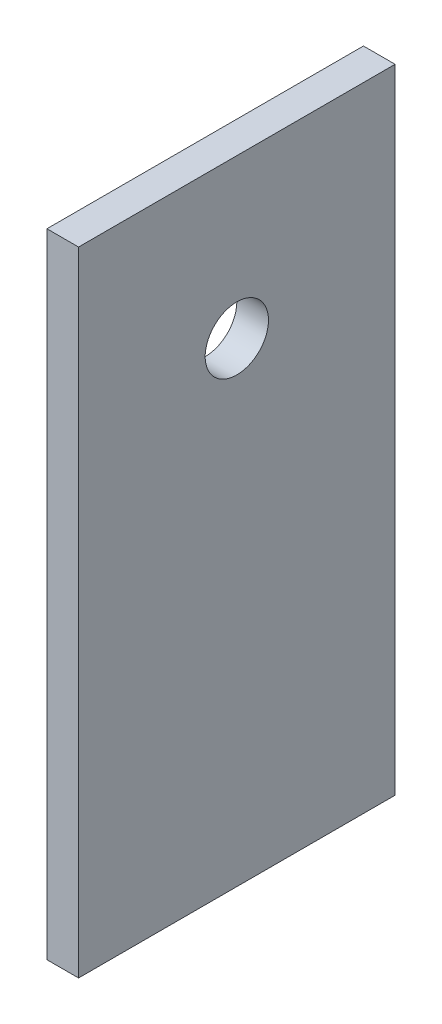
ISO-10303-21;
HEADER;
FILE_DESCRIPTION(('STEP AP214'),'2;1');
FILE_NAME('part.step','',(''),(''),'','','');
FILE_SCHEMA(('AUTOMOTIVE_DESIGN { 1 0 10303 214 1 1 1 1 }'));
ENDSEC;
DATA;
#1=APPLICATION_CONTEXT('core data for automotive mechanical design processes');
#2=APPLICATION_PROTOCOL_DEFINITION('international standard','automotive_design',2000,#1);
#3=PRODUCT_CONTEXT('',#1,'mechanical');
#4=PRODUCT('Part','Part','',(#3));
#5=PRODUCT_RELATED_PRODUCT_CATEGORY('part','',(#4));
#6=PRODUCT_DEFINITION_FORMATION('','',#4);
#7=PRODUCT_DEFINITION_CONTEXT('part definition',#1,'design');
#8=PRODUCT_DEFINITION('design','',#6,#7);
#9=PRODUCT_DEFINITION_SHAPE('','',#8);
#10=(LENGTH_UNIT() NAMED_UNIT(*) SI_UNIT(.MILLI.,.METRE.));
#11=(NAMED_UNIT(*) PLANE_ANGLE_UNIT() SI_UNIT($,.RADIAN.));
#12=(NAMED_UNIT(*) SI_UNIT($,.STERADIAN.) SOLID_ANGLE_UNIT());
#13=UNCERTAINTY_MEASURE_WITH_UNIT(LENGTH_MEASURE(1.E-05),#10,'distance_accuracy_value','');
#14=(GEOMETRIC_REPRESENTATION_CONTEXT(3) GLOBAL_UNCERTAINTY_ASSIGNED_CONTEXT((#13)) GLOBAL_UNIT_ASSIGNED_CONTEXT((#10,
#11,#12)) REPRESENTATION_CONTEXT('',''));
#15=CARTESIAN_POINT('',(0.,0.,0.));
#16=DIRECTION('',(0.,0.,1.));
#17=DIRECTION('',(1.,0.,0.));
#18=AXIS2_PLACEMENT_3D('',#15,#16,#17);
#19=CARTESIAN_POINT('',(4.,0.,0.));
#20=DIRECTION('',(1.,0.,0.));
#21=DIRECTION('',(0.,0.,-1.));
#22=AXIS2_PLACEMENT_3D('',#19,#20,#21);
#23=PLANE('',#22);
#24=DIRECTION('',(0.,1.,0.));
#25=VECTOR('',#24,1.);
#26=CARTESIAN_POINT('',(4.,-42.4999999999999,-20.));
#27=LINE('',#26,#25);
#28=CARTESIAN_POINT('',(4.,-122.5,-20.));
#29=VERTEX_POINT('',#28);
#30=CARTESIAN_POINT('',(4.,-42.4999999999999,-20.));
#31=VERTEX_POINT('',#30);
#32=EDGE_CURVE('E92',#29,#31,#27,.T.);
#33=ORIENTED_EDGE('',*,*,#32,.T.);
#34=DIRECTION('',(0.,0.,1.));
#35=VECTOR('',#34,1.);
#36=CARTESIAN_POINT('',(4.,-42.4999999999999,20.));
#37=LINE('',#36,#35);
#38=CARTESIAN_POINT('',(4.,-42.4999999999999,20.));
#39=VERTEX_POINT('',#38);
#40=EDGE_CURVE('E87',#31,#39,#37,.T.);
#41=ORIENTED_EDGE('',*,*,#40,.T.);
#42=DIRECTION('',(0.,-1.,0.));
#43=VECTOR('',#42,1.);
#44=CARTESIAN_POINT('',(4.,-42.4999999999999,20.));
#45=LINE('',#44,#43);
#46=CARTESIAN_POINT('',(4.,-122.5,20.));
#47=VERTEX_POINT('',#46);
#48=EDGE_CURVE('E90',#39,#47,#45,.T.);
#49=ORIENTED_EDGE('',*,*,#48,.T.);
#50=DIRECTION('',(0.,0.,-1.));
#51=VECTOR('',#50,1.);
#52=CARTESIAN_POINT('',(4.,-122.5,20.));
#53=LINE('',#52,#51);
#54=EDGE_CURVE('E57',#47,#29,#53,.T.);
#55=ORIENTED_EDGE('',*,*,#54,.T.);
#56=EDGE_LOOP('',(#33,#41,#49,#55));
#57=FACE_BOUND('',#56,.T.);
#58=CARTESIAN_POINT('',(4.,-62.4999999999999,0.));
#59=DIRECTION('',(1.,0.,0.));
#60=DIRECTION('',(0.,0.,-1.));
#61=AXIS2_PLACEMENT_3D('',#58,#59,#60);
#62=CIRCLE('',#61,4.);
#63=CARTESIAN_POINT('',(4.,-62.4999999999999,-4.));
#64=VERTEX_POINT('',#63);
#65=EDGE_CURVE('E112',#64,#64,#62,.T.);
#66=ORIENTED_EDGE('',*,*,#65,.F.);
#67=EDGE_LOOP('',(#66));
#68=FACE_BOUND('',#67,.T.);
#69=ADVANCED_FACE('F39',(#57,#68),#23,.T.);
#70=CARTESIAN_POINT('',(0.,0.,0.));
#71=DIRECTION('',(1.,0.,0.));
#72=DIRECTION('',(0.,0.,-1.));
#73=AXIS2_PLACEMENT_3D('',#70,#71,#72);
#74=PLANE('',#73);
#75=DIRECTION('',(0.,1.,0.));
#76=VECTOR('',#75,1.);
#77=CARTESIAN_POINT('',(0.,-42.4999999999999,-20.));
#78=LINE('',#77,#76);
#79=CARTESIAN_POINT('',(0.,-122.5,-20.));
#80=VERTEX_POINT('',#79);
#81=CARTESIAN_POINT('',(0.,-42.4999999999999,-20.));
#82=VERTEX_POINT('',#81);
#83=EDGE_CURVE('E108',#80,#82,#78,.T.);
#84=ORIENTED_EDGE('',*,*,#83,.F.);
#85=DIRECTION('',(0.,0.,-1.));
#86=VECTOR('',#85,1.);
#87=CARTESIAN_POINT('',(0.,-122.5,20.));
#88=LINE('',#87,#86);
#89=CARTESIAN_POINT('',(0.,-122.5,20.));
#90=VERTEX_POINT('',#89);
#91=EDGE_CURVE('E80',#90,#80,#88,.T.);
#92=ORIENTED_EDGE('',*,*,#91,.F.);
#93=DIRECTION('',(0.,-1.,0.));
#94=VECTOR('',#93,1.);
#95=CARTESIAN_POINT('',(0.,-42.4999999999999,20.));
#96=LINE('',#95,#94);
#97=CARTESIAN_POINT('',(0.,-42.4999999999999,20.));
#98=VERTEX_POINT('',#97);
#99=EDGE_CURVE('E74',#98,#90,#96,.T.);
#100=ORIENTED_EDGE('',*,*,#99,.F.);
#101=DIRECTION('',(0.,0.,1.));
#102=VECTOR('',#101,1.);
#103=CARTESIAN_POINT('',(0.,-42.4999999999999,20.));
#104=LINE('',#103,#102);
#105=EDGE_CURVE('E97',#82,#98,#104,.T.);
#106=ORIENTED_EDGE('',*,*,#105,.F.);
#107=EDGE_LOOP('',(#84,#92,#100,#106));
#108=FACE_BOUND('',#107,.T.);
#109=CARTESIAN_POINT('',(0.,-62.4999999999999,0.));
#110=DIRECTION('',(1.,0.,0.));
#111=DIRECTION('',(0.,0.,-1.));
#112=AXIS2_PLACEMENT_3D('',#109,#110,#111);
#113=CIRCLE('',#112,4.);
#114=CARTESIAN_POINT('',(0.,-62.4999999999999,-4.));
#115=VERTEX_POINT('',#114);
#116=EDGE_CURVE('E130',#115,#115,#113,.T.);
#117=ORIENTED_EDGE('',*,*,#116,.T.);
#118=EDGE_LOOP('',(#117));
#119=FACE_BOUND('',#118,.T.);
#120=ADVANCED_FACE('F125',(#108,#119),#74,.F.);
#121=CARTESIAN_POINT('',(4.,-42.4999999999999,-20.));
#122=DIRECTION('',(0.,0.,1.));
#123=DIRECTION('',(0.,-1.,0.));
#124=AXIS2_PLACEMENT_3D('',#121,#122,#123);
#125=PLANE('',#124);
#126=ORIENTED_EDGE('',*,*,#83,.T.);
#127=DIRECTION('',(-1.,0.,0.));
#128=VECTOR('',#127,1.);
#129=CARTESIAN_POINT('',(4.,-42.4999999999999,-20.));
#130=LINE('',#129,#128);
#131=EDGE_CURVE('E11',#31,#82,#130,.T.);
#132=ORIENTED_EDGE('',*,*,#131,.F.);
#133=ORIENTED_EDGE('',*,*,#32,.F.);
#134=DIRECTION('',(-1.,0.,0.));
#135=VECTOR('',#134,1.);
#136=CARTESIAN_POINT('',(4.,-122.5,-20.));
#137=LINE('',#136,#135);
#138=EDGE_CURVE('E104',#29,#80,#137,.T.);
#139=ORIENTED_EDGE('',*,*,#138,.T.);
#140=EDGE_LOOP('',(#126,#132,#133,#139));
#141=FACE_BOUND('',#140,.T.);
#142=ADVANCED_FACE('F41',(#141),#125,.F.);
#143=CARTESIAN_POINT('',(4.,-42.4999999999999,20.));
#144=DIRECTION('',(0.,-1.,0.));
#145=DIRECTION('',(0.,0.,-1.));
#146=AXIS2_PLACEMENT_3D('',#143,#144,#145);
#147=PLANE('',#146);
#148=ORIENTED_EDGE('',*,*,#105,.T.);
#149=DIRECTION('',(-1.,0.,0.));
#150=VECTOR('',#149,1.);
#151=CARTESIAN_POINT('',(4.,-42.4999999999999,20.));
#152=LINE('',#151,#150);
#153=EDGE_CURVE('E49',#39,#98,#152,.T.);
#154=ORIENTED_EDGE('',*,*,#153,.F.);
#155=ORIENTED_EDGE('',*,*,#40,.F.);
#156=ORIENTED_EDGE('',*,*,#131,.T.);
#157=EDGE_LOOP('',(#148,#154,#155,#156));
#158=FACE_BOUND('',#157,.T.);
#159=ADVANCED_FACE('F96',(#158),#147,.F.);
#160=CARTESIAN_POINT('',(4.,-42.4999999999999,20.));
#161=DIRECTION('',(0.,0.,-1.));
#162=DIRECTION('',(0.,1.,0.));
#163=AXIS2_PLACEMENT_3D('',#160,#161,#162);
#164=PLANE('',#163);
#165=ORIENTED_EDGE('',*,*,#99,.T.);
#166=DIRECTION('',(-1.,0.,0.));
#167=VECTOR('',#166,1.);
#168=CARTESIAN_POINT('',(4.,-122.5,20.));
#169=LINE('',#168,#167);
#170=EDGE_CURVE('E99',#47,#90,#169,.T.);
#171=ORIENTED_EDGE('',*,*,#170,.F.);
#172=ORIENTED_EDGE('',*,*,#48,.F.);
#173=ORIENTED_EDGE('',*,*,#153,.T.);
#174=EDGE_LOOP('',(#165,#171,#172,#173));
#175=FACE_BOUND('',#174,.T.);
#176=ADVANCED_FACE('F100',(#175),#164,.F.);
#177=CARTESIAN_POINT('',(4.,-122.5,20.));
#178=DIRECTION('',(0.,1.,0.));
#179=DIRECTION('',(0.,0.,1.));
#180=AXIS2_PLACEMENT_3D('',#177,#178,#179);
#181=PLANE('',#180);
#182=ORIENTED_EDGE('',*,*,#91,.T.);
#183=ORIENTED_EDGE('',*,*,#138,.F.);
#184=ORIENTED_EDGE('',*,*,#54,.F.);
#185=ORIENTED_EDGE('',*,*,#170,.T.);
#186=EDGE_LOOP('',(#182,#183,#184,#185));
#187=FACE_BOUND('',#186,.T.);
#188=ADVANCED_FACE('F122',(#187),#181,.F.);
#189=CARTESIAN_POINT('',(4.,-62.4999999999999,0.));
#190=DIRECTION('',(-1.,0.,0.));
#191=DIRECTION('',(0.,0.,1.));
#192=AXIS2_PLACEMENT_3D('',#189,#190,#191);
#193=CYLINDRICAL_SURFACE('',#192,4.);
#194=ORIENTED_EDGE('',*,*,#65,.T.);
#195=EDGE_LOOP('',(#194));
#196=FACE_BOUND('',#195,.T.);
#197=ORIENTED_EDGE('',*,*,#116,.F.);
#198=EDGE_LOOP('',(#197));
#199=FACE_BOUND('',#198,.T.);
#200=ADVANCED_FACE('F138',(#196,#199),#193,.F.);
#201=CLOSED_SHELL('',(#69,#120,#142,#159,#176,#188,#200));
#202=MANIFOLD_SOLID_BREP('B2',#201);
#203=ADVANCED_BREP_SHAPE_REPRESENTATION('',(#18,#202),#14);
#204=SHAPE_DEFINITION_REPRESENTATION(#9,#203);
ENDSEC;
END-ISO-10303-21;
